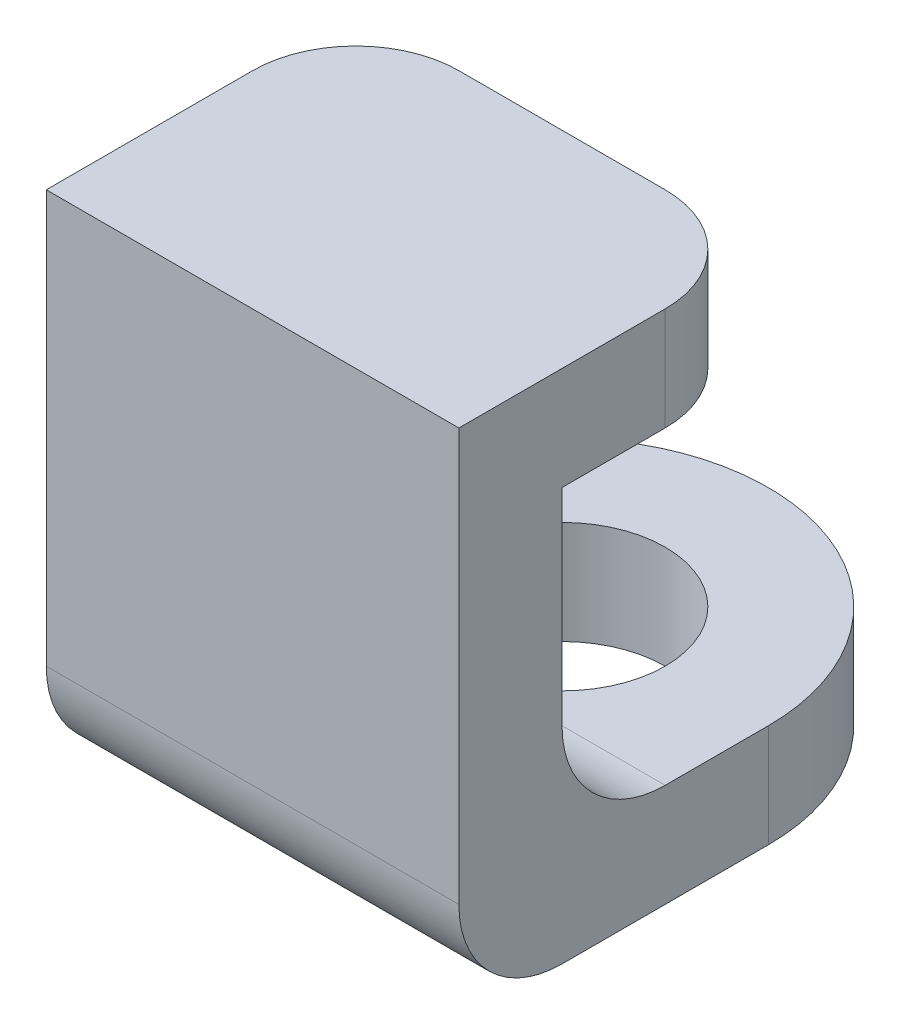
ISO-10303-21;
HEADER;
FILE_DESCRIPTION(('STEP AP214'),'2;1');
FILE_NAME('part.step','',(''),(''),'','','');
FILE_SCHEMA(('AUTOMOTIVE_DESIGN { 1 0 10303 214 1 1 1 1 }'));
ENDSEC;
DATA;
#1=APPLICATION_CONTEXT('core data for automotive mechanical design processes');
#2=APPLICATION_PROTOCOL_DEFINITION('international standard','automotive_design',2000,#1);
#3=PRODUCT_CONTEXT('',#1,'mechanical');
#4=PRODUCT('Part','Part','',(#3));
#5=PRODUCT_RELATED_PRODUCT_CATEGORY('part','',(#4));
#6=PRODUCT_DEFINITION_FORMATION('','',#4);
#7=PRODUCT_DEFINITION_CONTEXT('part definition',#1,'design');
#8=PRODUCT_DEFINITION('design','',#6,#7);
#9=PRODUCT_DEFINITION_SHAPE('','',#8);
#10=(LENGTH_UNIT() NAMED_UNIT(*) SI_UNIT(.MILLI.,.METRE.));
#11=(NAMED_UNIT(*) PLANE_ANGLE_UNIT() SI_UNIT($,.RADIAN.));
#12=(NAMED_UNIT(*) SI_UNIT($,.STERADIAN.) SOLID_ANGLE_UNIT());
#13=UNCERTAINTY_MEASURE_WITH_UNIT(LENGTH_MEASURE(1.E-05),#10,'distance_accuracy_value','');
#14=(GEOMETRIC_REPRESENTATION_CONTEXT(3) GLOBAL_UNCERTAINTY_ASSIGNED_CONTEXT((#13)) GLOBAL_UNIT_ASSIGNED_CONTEXT((#10,
#11,#12)) REPRESENTATION_CONTEXT('',''));
#15=CARTESIAN_POINT('',(0.,0.,0.));
#16=DIRECTION('',(0.,0.,1.));
#17=DIRECTION('',(1.,0.,0.));
#18=AXIS2_PLACEMENT_3D('',#15,#16,#17);
#19=CARTESIAN_POINT('',(4.,-5.,1.99999999999999));
#20=DIRECTION('',(0.,1.,0.));
#21=DIRECTION('',(0.,0.,1.));
#22=AXIS2_PLACEMENT_3D('',#19,#20,#21);
#23=PLANE('',#22);
#24=CARTESIAN_POINT('',(2.,-5.,0.));
#25=DIRECTION('',(0.,-1.,0.));
#26=DIRECTION('',(0.,0.,-1.));
#27=AXIS2_PLACEMENT_3D('',#24,#25,#26);
#28=CIRCLE('',#27,1.);
#29=CARTESIAN_POINT('',(2.,-5.,-1.));
#30=VERTEX_POINT('',#29);
#31=EDGE_CURVE('E200',#30,#30,#28,.T.);
#32=ORIENTED_EDGE('',*,*,#31,.F.);
#33=EDGE_LOOP('',(#32));
#34=FACE_BOUND('',#33,.T.);
#35=CARTESIAN_POINT('',(2.,-5.,0.));
#36=DIRECTION('',(0.,-1.,0.));
#37=DIRECTION('',(0.,0.,-1.));
#38=AXIS2_PLACEMENT_3D('',#35,#36,#37);
#39=CIRCLE('',#38,2.);
#40=CARTESIAN_POINT('',(0.,-5.,0.));
#41=VERTEX_POINT('',#40);
#42=CARTESIAN_POINT('',(4.,-5.,0.));
#43=VERTEX_POINT('',#42);
#44=EDGE_CURVE('E73',#41,#43,#39,.T.);
#45=ORIENTED_EDGE('',*,*,#44,.T.);
#46=DIRECTION('',(0.,0.,-1.));
#47=VECTOR('',#46,1.);
#48=CARTESIAN_POINT('',(4.,-5.,1.99999999999999));
#49=LINE('',#48,#47);
#50=CARTESIAN_POINT('',(4.,-5.,1.99999999999999));
#51=VERTEX_POINT('',#50);
#52=EDGE_CURVE('E40',#51,#43,#49,.T.);
#53=ORIENTED_EDGE('',*,*,#52,.F.);
#54=DIRECTION('',(-1.,0.,0.));
#55=VECTOR('',#54,1.);
#56=CARTESIAN_POINT('',(4.,-5.,1.99999999999999));
#57=LINE('',#56,#55);
#58=CARTESIAN_POINT('',(0.,-5.,1.99999999999999));
#59=VERTEX_POINT('',#58);
#60=EDGE_CURVE('E182',#51,#59,#57,.T.);
#61=ORIENTED_EDGE('',*,*,#60,.T.);
#62=DIRECTION('',(0.,0.,-1.));
#63=VECTOR('',#62,1.);
#64=CARTESIAN_POINT('',(0.,-5.,1.99999999999999));
#65=LINE('',#64,#63);
#66=EDGE_CURVE('E226',#59,#41,#65,.T.);
#67=ORIENTED_EDGE('',*,*,#66,.T.);
#68=EDGE_LOOP('',(#45,#53,#61,#67));
#69=FACE_BOUND('',#68,.T.);
#70=ADVANCED_FACE('F36',(#34,#69),#23,.F.);
#71=CARTESIAN_POINT('',(4.,-4.,-2.));
#72=DIRECTION('',(0.,-1.,0.));
#73=DIRECTION('',(0.,0.,-1.));
#74=AXIS2_PLACEMENT_3D('',#71,#72,#73);
#75=PLANE('',#74);
#76=DIRECTION('',(-1.,0.,0.));
#77=VECTOR('',#76,1.);
#78=CARTESIAN_POINT('',(4.,-4.,0.999999999999993));
#79=LINE('',#78,#77);
#80=CARTESIAN_POINT('',(2.,-4.,0.999999999999993));
#81=VERTEX_POINT('',#80);
#82=CARTESIAN_POINT('',(0.,-4.,0.999999999999993));
#83=VERTEX_POINT('',#82);
#84=EDGE_CURVE('E178',#81,#83,#79,.T.);
#85=ORIENTED_EDGE('',*,*,#84,.F.);
#86=CARTESIAN_POINT('',(2.,-4.,0.));
#87=DIRECTION('',(0.,-1.,0.));
#88=DIRECTION('',(0.,0.,-1.));
#89=AXIS2_PLACEMENT_3D('',#86,#87,#88);
#90=CIRCLE('',#89,1.);
#91=EDGE_CURVE('E50',#81,#81,#90,.T.);
#92=ORIENTED_EDGE('',*,*,#91,.T.);
#93=CARTESIAN_POINT('',(4.,-4.,0.999999999999993));
#94=VERTEX_POINT('',#93);
#95=EDGE_CURVE('E179',#94,#81,#79,.T.);
#96=ORIENTED_EDGE('',*,*,#95,.F.);
#97=DIRECTION('',(0.,0.,1.));
#98=VECTOR('',#97,1.);
#99=CARTESIAN_POINT('',(4.,-4.,-2.));
#100=LINE('',#99,#98);
#101=CARTESIAN_POINT('',(4.,-4.,0.));
#102=VERTEX_POINT('',#101);
#103=EDGE_CURVE('E213',#102,#94,#100,.T.);
#104=ORIENTED_EDGE('',*,*,#103,.F.);
#105=CARTESIAN_POINT('',(2.,-4.,0.));
#106=DIRECTION('',(0.,-1.,0.));
#107=DIRECTION('',(0.,0.,-1.));
#108=AXIS2_PLACEMENT_3D('',#105,#106,#107);
#109=CIRCLE('',#108,2.);
#110=CARTESIAN_POINT('',(0.,-4.,0.));
#111=VERTEX_POINT('',#110);
#112=EDGE_CURVE('E45',#111,#102,#109,.T.);
#113=ORIENTED_EDGE('',*,*,#112,.F.);
#114=DIRECTION('',(0.,0.,1.));
#115=VECTOR('',#114,1.);
#116=CARTESIAN_POINT('',(0.,-4.,-2.));
#117=LINE('',#116,#115);
#118=EDGE_CURVE('E228',#111,#83,#117,.T.);
#119=ORIENTED_EDGE('',*,*,#118,.T.);
#120=EDGE_LOOP('',(#85,#92,#96,#104,#113,#119));
#121=FACE_BOUND('',#120,.T.);
#122=ADVANCED_FACE('F245',(#121),#75,.F.);
#123=CARTESIAN_POINT('',(4.,0.,0.));
#124=DIRECTION('',(0.,-1.,0.));
#125=DIRECTION('',(0.,0.,-1.));
#126=AXIS2_PLACEMENT_3D('',#123,#124,#125);
#127=PLANE('',#126);
#128=CARTESIAN_POINT('',(1.,0.,1.));
#129=DIRECTION('',(0.,1.,0.));
#130=DIRECTION('',(0.,0.,1.));
#131=AXIS2_PLACEMENT_3D('',#128,#129,#130);
#132=CIRCLE('',#131,1.);
#133=CARTESIAN_POINT('',(1.00000000000001,0.,0.));
#134=VERTEX_POINT('',#133);
#135=CARTESIAN_POINT('',(0.,0.,1.00000000000001));
#136=VERTEX_POINT('',#135);
#137=EDGE_CURVE('E204',#134,#136,#132,.T.);
#138=ORIENTED_EDGE('',*,*,#137,.T.);
#139=DIRECTION('',(0.,0.,1.));
#140=VECTOR('',#139,1.);
#141=CARTESIAN_POINT('',(0.,0.,0.));
#142=LINE('',#141,#140);
#143=CARTESIAN_POINT('',(0.,0.,3.));
#144=VERTEX_POINT('',#143);
#145=EDGE_CURVE('E153',#136,#144,#142,.T.);
#146=ORIENTED_EDGE('',*,*,#145,.T.);
#147=DIRECTION('',(-1.,0.,0.));
#148=VECTOR('',#147,1.);
#149=CARTESIAN_POINT('',(4.,0.,3.));
#150=LINE('',#149,#148);
#151=CARTESIAN_POINT('',(4.,0.,3.));
#152=VERTEX_POINT('',#151);
#153=EDGE_CURVE('E188',#152,#144,#150,.T.);
#154=ORIENTED_EDGE('',*,*,#153,.F.);
#155=DIRECTION('',(0.,0.,1.));
#156=VECTOR('',#155,1.);
#157=CARTESIAN_POINT('',(4.,0.,0.));
#158=LINE('',#157,#156);
#159=CARTESIAN_POINT('',(4.,0.,1.00000000000001));
#160=VERTEX_POINT('',#159);
#161=EDGE_CURVE('E162',#160,#152,#158,.T.);
#162=ORIENTED_EDGE('',*,*,#161,.F.);
#163=CARTESIAN_POINT('',(3.,0.,1.));
#164=DIRECTION('',(0.,1.,0.));
#165=DIRECTION('',(0.,0.,1.));
#166=AXIS2_PLACEMENT_3D('',#163,#164,#165);
#167=CIRCLE('',#166,1.);
#168=CARTESIAN_POINT('',(2.99999999999999,0.,0.));
#169=VERTEX_POINT('',#168);
#170=EDGE_CURVE('E195',#169,#160,#167,.F.);
#171=ORIENTED_EDGE('',*,*,#170,.F.);
#172=DIRECTION('',(-1.,0.,0.));
#173=VECTOR('',#172,1.);
#174=CARTESIAN_POINT('',(4.,0.,0.));
#175=LINE('',#174,#173);
#176=EDGE_CURVE('E155',#169,#134,#175,.T.);
#177=ORIENTED_EDGE('',*,*,#176,.T.);
#178=EDGE_LOOP('',(#138,#146,#154,#162,#171,#177));
#179=FACE_BOUND('',#178,.T.);
#180=ADVANCED_FACE('F247',(#179),#127,.F.);
#181=CARTESIAN_POINT('',(4.,-1.,2.));
#182=DIRECTION('',(0.,1.,0.));
#183=DIRECTION('',(0.,0.,1.));
#184=AXIS2_PLACEMENT_3D('',#181,#182,#183);
#185=PLANE('',#184);
#186=CARTESIAN_POINT('',(1.,-1.,1.));
#187=DIRECTION('',(0.,1.,0.));
#188=DIRECTION('',(0.,0.,1.));
#189=AXIS2_PLACEMENT_3D('',#186,#187,#188);
#190=CIRCLE('',#189,1.);
#191=CARTESIAN_POINT('',(1.00000000000001,-1.,0.));
#192=VERTEX_POINT('',#191);
#193=CARTESIAN_POINT('',(0.,-1.,1.));
#194=VERTEX_POINT('',#193);
#195=EDGE_CURVE('E132',#192,#194,#190,.T.);
#196=ORIENTED_EDGE('',*,*,#195,.F.);
#197=DIRECTION('',(-1.,0.,0.));
#198=VECTOR('',#197,1.);
#199=CARTESIAN_POINT('',(4.,-1.,0.));
#200=LINE('',#199,#198);
#201=CARTESIAN_POINT('',(2.99999999999999,-1.,0.));
#202=VERTEX_POINT('',#201);
#203=EDGE_CURVE('E171',#202,#192,#200,.T.);
#204=ORIENTED_EDGE('',*,*,#203,.F.);
#205=CARTESIAN_POINT('',(3.,-1.,1.));
#206=DIRECTION('',(0.,1.,0.));
#207=DIRECTION('',(0.,0.,1.));
#208=AXIS2_PLACEMENT_3D('',#205,#206,#207);
#209=CIRCLE('',#208,1.);
#210=CARTESIAN_POINT('',(4.,-1.,1.00000000000001));
#211=VERTEX_POINT('',#210);
#212=EDGE_CURVE('E143',#202,#211,#209,.F.);
#213=ORIENTED_EDGE('',*,*,#212,.T.);
#214=DIRECTION('',(0.,0.,-1.));
#215=VECTOR('',#214,1.);
#216=CARTESIAN_POINT('',(4.,-1.,2.));
#217=LINE('',#216,#215);
#218=CARTESIAN_POINT('',(4.,-1.,2.));
#219=VERTEX_POINT('',#218);
#220=EDGE_CURVE('E173',#219,#211,#217,.T.);
#221=ORIENTED_EDGE('',*,*,#220,.F.);
#222=DIRECTION('',(-1.,0.,0.));
#223=VECTOR('',#222,1.);
#224=CARTESIAN_POINT('',(4.,-1.,2.));
#225=LINE('',#224,#223);
#226=CARTESIAN_POINT('',(0.,-1.,2.));
#227=VERTEX_POINT('',#226);
#228=EDGE_CURVE('E161',#219,#227,#225,.T.);
#229=ORIENTED_EDGE('',*,*,#228,.T.);
#230=DIRECTION('',(0.,0.,-1.));
#231=VECTOR('',#230,1.);
#232=CARTESIAN_POINT('',(0.,-1.,2.));
#233=LINE('',#232,#231);
#234=EDGE_CURVE('E151',#227,#194,#233,.T.);
#235=ORIENTED_EDGE('',*,*,#234,.T.);
#236=EDGE_LOOP('',(#196,#204,#213,#221,#229,#235));
#237=FACE_BOUND('',#236,.T.);
#238=ADVANCED_FACE('F158',(#237),#185,.F.);
#239=CARTESIAN_POINT('',(0.,-4.,2.));
#240=DIRECTION('',(1.,0.,0.));
#241=DIRECTION('',(0.,0.,-1.));
#242=AXIS2_PLACEMENT_3D('',#239,#240,#241);
#243=PLANE('',#242);
#244=ORIENTED_EDGE('',*,*,#118,.F.);
#245=DIRECTION('',(0.,-1.,0.));
#246=VECTOR('',#245,1.);
#247=CARTESIAN_POINT('',(0.,-2.,0.));
#248=LINE('',#247,#246);
#249=EDGE_CURVE('E58',#111,#41,#248,.T.);
#250=ORIENTED_EDGE('',*,*,#249,.T.);
#251=ORIENTED_EDGE('',*,*,#66,.F.);
#252=CARTESIAN_POINT('',(0.,-4.,2.));
#253=DIRECTION('',(1.,0.,0.));
#254=DIRECTION('',(0.,0.,-1.));
#255=AXIS2_PLACEMENT_3D('',#252,#253,#254);
#256=CIRCLE('',#255,1.);
#257=CARTESIAN_POINT('',(0.,-3.99999999999999,3.));
#258=VERTEX_POINT('',#257);
#259=EDGE_CURVE('E224',#258,#59,#256,.T.);
#260=ORIENTED_EDGE('',*,*,#259,.F.);
#261=DIRECTION('',(0.,-1.,0.));
#262=VECTOR('',#261,1.);
#263=CARTESIAN_POINT('',(0.,0.,3.));
#264=LINE('',#263,#262);
#265=EDGE_CURVE('E222',#144,#258,#264,.T.);
#266=ORIENTED_EDGE('',*,*,#265,.F.);
#267=ORIENTED_EDGE('',*,*,#145,.F.);
#268=DIRECTION('',(0.,1.,0.));
#269=VECTOR('',#268,1.);
#270=CARTESIAN_POINT('',(0.,-3.,1.));
#271=LINE('',#270,#269);
#272=EDGE_CURVE('E135',#194,#136,#271,.T.);
#273=ORIENTED_EDGE('',*,*,#272,.F.);
#274=ORIENTED_EDGE('',*,*,#234,.F.);
#275=DIRECTION('',(0.,1.,0.));
#276=VECTOR('',#275,1.);
#277=CARTESIAN_POINT('',(0.,-2.99999999999999,2.));
#278=LINE('',#277,#276);
#279=CARTESIAN_POINT('',(0.,-3.,2.));
#280=VERTEX_POINT('',#279);
#281=EDGE_CURVE('E163',#280,#227,#278,.T.);
#282=ORIENTED_EDGE('',*,*,#281,.F.);
#283=CARTESIAN_POINT('',(0.,-3.,1.));
#284=DIRECTION('',(-1.,0.,0.));
#285=DIRECTION('',(0.,0.,1.));
#286=AXIS2_PLACEMENT_3D('',#283,#284,#285);
#287=CIRCLE('',#286,1.);
#288=EDGE_CURVE('E167',#83,#280,#287,.T.);
#289=ORIENTED_EDGE('',*,*,#288,.F.);
#290=EDGE_LOOP('',(#244,#250,#251,#260,#266,#267,#273,#274,#282,#289));
#291=FACE_BOUND('',#290,.T.);
#292=ADVANCED_FACE('F149',(#291),#243,.F.);
#293=CARTESIAN_POINT('',(4.,-1.,0.));
#294=DIRECTION('',(0.,0.,1.));
#295=DIRECTION('',(1.,0.,0.));
#296=AXIS2_PLACEMENT_3D('',#293,#294,#295);
#297=PLANE('',#296);
#298=ORIENTED_EDGE('',*,*,#203,.T.);
#299=DIRECTION('',(0.,1.,0.));
#300=VECTOR('',#299,1.);
#301=CARTESIAN_POINT('',(1.00000000000001,-3.,0.));
#302=LINE('',#301,#300);
#303=EDGE_CURVE('E138',#192,#134,#302,.T.);
#304=ORIENTED_EDGE('',*,*,#303,.T.);
#305=ORIENTED_EDGE('',*,*,#176,.F.);
#306=DIRECTION('',(0.,1.,0.));
#307=VECTOR('',#306,1.);
#308=CARTESIAN_POINT('',(2.99999999999999,-3.,0.));
#309=LINE('',#308,#307);
#310=EDGE_CURVE('E196',#202,#169,#309,.T.);
#311=ORIENTED_EDGE('',*,*,#310,.F.);
#312=EDGE_LOOP('',(#298,#304,#305,#311));
#313=FACE_BOUND('',#312,.T.);
#314=ADVANCED_FACE('F38',(#313),#297,.F.);
#315=CARTESIAN_POINT('',(4.,0.,3.));
#316=DIRECTION('',(0.,0.,-1.));
#317=DIRECTION('',(0.,1.,0.));
#318=AXIS2_PLACEMENT_3D('',#315,#316,#317);
#319=PLANE('',#318);
#320=ORIENTED_EDGE('',*,*,#265,.T.);
#321=DIRECTION('',(-1.,0.,0.));
#322=VECTOR('',#321,1.);
#323=CARTESIAN_POINT('',(4.,-3.99999999999999,3.));
#324=LINE('',#323,#322);
#325=CARTESIAN_POINT('',(4.,-3.99999999999999,3.));
#326=VERTEX_POINT('',#325);
#327=EDGE_CURVE('E185',#326,#258,#324,.T.);
#328=ORIENTED_EDGE('',*,*,#327,.F.);
#329=DIRECTION('',(0.,-1.,0.));
#330=VECTOR('',#329,1.);
#331=CARTESIAN_POINT('',(4.,0.,3.));
#332=LINE('',#331,#330);
#333=EDGE_CURVE('E165',#152,#326,#332,.T.);
#334=ORIENTED_EDGE('',*,*,#333,.F.);
#335=ORIENTED_EDGE('',*,*,#153,.T.);
#336=EDGE_LOOP('',(#320,#328,#334,#335));
#337=FACE_BOUND('',#336,.T.);
#338=ADVANCED_FACE('F262',(#337),#319,.F.);
#339=CARTESIAN_POINT('',(4.,-4.,2.));
#340=DIRECTION('',(-1.,0.,0.));
#341=DIRECTION('',(0.,0.,1.));
#342=AXIS2_PLACEMENT_3D('',#339,#340,#341);
#343=CYLINDRICAL_SURFACE('',#342,1.);
#344=ORIENTED_EDGE('',*,*,#259,.T.);
#345=ORIENTED_EDGE('',*,*,#60,.F.);
#346=CARTESIAN_POINT('',(4.,-4.,2.));
#347=DIRECTION('',(1.,0.,0.));
#348=DIRECTION('',(0.,0.,-1.));
#349=AXIS2_PLACEMENT_3D('',#346,#347,#348);
#350=CIRCLE('',#349,1.);
#351=EDGE_CURVE('E211',#326,#51,#350,.T.);
#352=ORIENTED_EDGE('',*,*,#351,.F.);
#353=ORIENTED_EDGE('',*,*,#327,.T.);
#354=EDGE_LOOP('',(#344,#345,#352,#353));
#355=FACE_BOUND('',#354,.T.);
#356=ADVANCED_FACE('F259',(#355),#343,.T.);
#357=CARTESIAN_POINT('',(4.,-3.,1.));
#358=DIRECTION('',(-1.,0.,0.));
#359=DIRECTION('',(0.,0.,1.));
#360=AXIS2_PLACEMENT_3D('',#357,#358,#359);
#361=CYLINDRICAL_SURFACE('',#360,1.);
#362=ORIENTED_EDGE('',*,*,#288,.T.);
#363=DIRECTION('',(-1.,0.,0.));
#364=VECTOR('',#363,1.);
#365=CARTESIAN_POINT('',(4.,-3.,2.));
#366=LINE('',#365,#364);
#367=CARTESIAN_POINT('',(4.,-3.,2.));
#368=VERTEX_POINT('',#367);
#369=EDGE_CURVE('E175',#368,#280,#366,.T.);
#370=ORIENTED_EDGE('',*,*,#369,.F.);
#371=CARTESIAN_POINT('',(4.,-3.,1.));
#372=DIRECTION('',(-1.,0.,0.));
#373=DIRECTION('',(0.,0.,1.));
#374=AXIS2_PLACEMENT_3D('',#371,#372,#373);
#375=CIRCLE('',#374,1.);
#376=EDGE_CURVE('E215',#94,#368,#375,.T.);
#377=ORIENTED_EDGE('',*,*,#376,.F.);
#378=ORIENTED_EDGE('',*,*,#95,.T.);
#379=ORIENTED_EDGE('',*,*,#84,.T.);
#380=EDGE_LOOP('',(#362,#370,#377,#378,#379));
#381=FACE_BOUND('',#380,.T.);
#382=ADVANCED_FACE('F233',(#381),#361,.F.);
#383=CARTESIAN_POINT('',(4.,-2.99999999999999,2.));
#384=DIRECTION('',(0.,0.,1.));
#385=DIRECTION('',(1.,0.,0.));
#386=AXIS2_PLACEMENT_3D('',#383,#384,#385);
#387=PLANE('',#386);
#388=ORIENTED_EDGE('',*,*,#281,.T.);
#389=ORIENTED_EDGE('',*,*,#228,.F.);
#390=DIRECTION('',(0.,1.,0.));
#391=VECTOR('',#390,1.);
#392=CARTESIAN_POINT('',(4.,-2.99999999999999,2.));
#393=LINE('',#392,#391);
#394=EDGE_CURVE('E217',#368,#219,#393,.T.);
#395=ORIENTED_EDGE('',*,*,#394,.F.);
#396=ORIENTED_EDGE('',*,*,#369,.T.);
#397=EDGE_LOOP('',(#388,#389,#395,#396));
#398=FACE_BOUND('',#397,.T.);
#399=ADVANCED_FACE('F238',(#398),#387,.F.);
#400=CARTESIAN_POINT('',(4.,-4.,2.));
#401=DIRECTION('',(1.,0.,0.));
#402=DIRECTION('',(0.,0.,-1.));
#403=AXIS2_PLACEMENT_3D('',#400,#401,#402);
#404=PLANE('',#403);
#405=DIRECTION('',(0.,-1.,0.));
#406=VECTOR('',#405,1.);
#407=CARTESIAN_POINT('',(4.,-2.,0.));
#408=LINE('',#407,#406);
#409=EDGE_CURVE('E12',#102,#43,#408,.T.);
#410=ORIENTED_EDGE('',*,*,#409,.F.);
#411=ORIENTED_EDGE('',*,*,#103,.T.);
#412=ORIENTED_EDGE('',*,*,#376,.T.);
#413=ORIENTED_EDGE('',*,*,#394,.T.);
#414=ORIENTED_EDGE('',*,*,#220,.T.);
#415=DIRECTION('',(0.,1.,0.));
#416=VECTOR('',#415,1.);
#417=CARTESIAN_POINT('',(4.,-3.,1.));
#418=LINE('',#417,#416);
#419=EDGE_CURVE('E154',#160,#211,#418,.F.);
#420=ORIENTED_EDGE('',*,*,#419,.F.);
#421=ORIENTED_EDGE('',*,*,#161,.T.);
#422=ORIENTED_EDGE('',*,*,#333,.T.);
#423=ORIENTED_EDGE('',*,*,#351,.T.);
#424=ORIENTED_EDGE('',*,*,#52,.T.);
#425=EDGE_LOOP('',(#410,#411,#412,#413,#414,#420,#421,#422,#423,#424));
#426=FACE_BOUND('',#425,.T.);
#427=ADVANCED_FACE('F240',(#426),#404,.T.);
#428=CARTESIAN_POINT('',(1.,-3.,1.));
#429=DIRECTION('',(0.,1.,0.));
#430=DIRECTION('',(0.,0.,1.));
#431=AXIS2_PLACEMENT_3D('',#428,#429,#430);
#432=CYLINDRICAL_SURFACE('',#431,1.);
#433=ORIENTED_EDGE('',*,*,#195,.T.);
#434=ORIENTED_EDGE('',*,*,#272,.T.);
#435=ORIENTED_EDGE('',*,*,#137,.F.);
#436=ORIENTED_EDGE('',*,*,#303,.F.);
#437=EDGE_LOOP('',(#433,#434,#435,#436));
#438=FACE_BOUND('',#437,.T.);
#439=ADVANCED_FACE('F134',(#438),#432,.T.);
#440=CARTESIAN_POINT('',(3.,-3.,1.));
#441=DIRECTION('',(0.,1.,0.));
#442=DIRECTION('',(0.,0.,1.));
#443=AXIS2_PLACEMENT_3D('',#440,#441,#442);
#444=CYLINDRICAL_SURFACE('',#443,1.);
#445=ORIENTED_EDGE('',*,*,#310,.T.);
#446=ORIENTED_EDGE('',*,*,#170,.T.);
#447=ORIENTED_EDGE('',*,*,#419,.T.);
#448=ORIENTED_EDGE('',*,*,#212,.F.);
#449=EDGE_LOOP('',(#445,#446,#447,#448));
#450=FACE_BOUND('',#449,.T.);
#451=ADVANCED_FACE('F282',(#450),#444,.T.);
#452=CARTESIAN_POINT('',(2.,-2.,0.));
#453=DIRECTION('',(0.,-1.,0.));
#454=DIRECTION('',(0.,0.,-1.));
#455=AXIS2_PLACEMENT_3D('',#452,#453,#454);
#456=CYLINDRICAL_SURFACE('',#455,2.);
#457=ORIENTED_EDGE('',*,*,#44,.F.);
#458=ORIENTED_EDGE('',*,*,#249,.F.);
#459=ORIENTED_EDGE('',*,*,#112,.T.);
#460=ORIENTED_EDGE('',*,*,#409,.T.);
#461=EDGE_LOOP('',(#457,#458,#459,#460));
#462=FACE_BOUND('',#461,.T.);
#463=ADVANCED_FACE('F284',(#462),#456,.T.);
#464=CARTESIAN_POINT('',(2.,-2.,0.));
#465=DIRECTION('',(0.,-1.,0.));
#466=DIRECTION('',(0.,0.,-1.));
#467=AXIS2_PLACEMENT_3D('',#464,#465,#466);
#468=CYLINDRICAL_SURFACE('',#467,1.);
#469=ORIENTED_EDGE('',*,*,#31,.T.);
#470=EDGE_LOOP('',(#469));
#471=FACE_BOUND('',#470,.T.);
#472=ORIENTED_EDGE('',*,*,#91,.F.);
#473=EDGE_LOOP('',(#472));
#474=FACE_BOUND('',#473,.T.);
#475=ADVANCED_FACE('F290',(#471,#474),#468,.F.);
#476=CLOSED_SHELL('',(#70,#122,#180,#238,#292,#314,#338,#356,#382,#399,#427,#439,#451,#463,#475));
#477=MANIFOLD_SOLID_BREP('B2',#476);
#478=ADVANCED_BREP_SHAPE_REPRESENTATION('',(#18,#477),#14);
#479=SHAPE_DEFINITION_REPRESENTATION(#9,#478);
ENDSEC;
END-ISO-10303-21;
